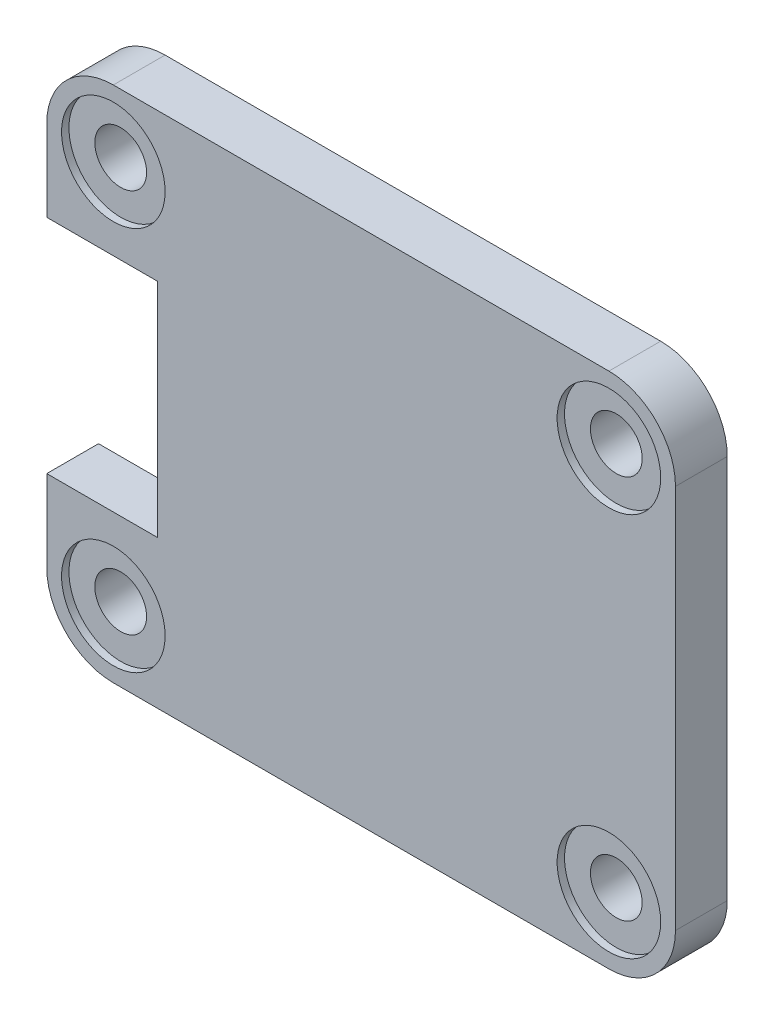
ISO-10303-21;
HEADER;
FILE_DESCRIPTION(('STEP AP214'),'2;1');
FILE_NAME('part.step','',(''),(''),'','','');
FILE_SCHEMA(('AUTOMOTIVE_DESIGN { 1 0 10303 214 1 1 1 1 }'));
ENDSEC;
DATA;
#1=APPLICATION_CONTEXT('core data for automotive mechanical design processes');
#2=APPLICATION_PROTOCOL_DEFINITION('international standard','automotive_design',2000,#1);
#3=PRODUCT_CONTEXT('',#1,'mechanical');
#4=PRODUCT('Part','Part','',(#3));
#5=PRODUCT_RELATED_PRODUCT_CATEGORY('part','',(#4));
#6=PRODUCT_DEFINITION_FORMATION('','',#4);
#7=PRODUCT_DEFINITION_CONTEXT('part definition',#1,'design');
#8=PRODUCT_DEFINITION('design','',#6,#7);
#9=PRODUCT_DEFINITION_SHAPE('','',#8);
#10=(LENGTH_UNIT() NAMED_UNIT(*) SI_UNIT(.MILLI.,.METRE.));
#11=(NAMED_UNIT(*) PLANE_ANGLE_UNIT() SI_UNIT($,.RADIAN.));
#12=(NAMED_UNIT(*) SI_UNIT($,.STERADIAN.) SOLID_ANGLE_UNIT());
#13=UNCERTAINTY_MEASURE_WITH_UNIT(LENGTH_MEASURE(1.E-05),#10,'distance_accuracy_value','');
#14=(GEOMETRIC_REPRESENTATION_CONTEXT(3) GLOBAL_UNCERTAINTY_ASSIGNED_CONTEXT((#13)) GLOBAL_UNIT_ASSIGNED_CONTEXT((#10,
#11,#12)) REPRESENTATION_CONTEXT('',''));
#15=CARTESIAN_POINT('',(0.,0.,0.));
#16=DIRECTION('',(0.,0.,1.));
#17=DIRECTION('',(1.,0.,0.));
#18=AXIS2_PLACEMENT_3D('',#15,#16,#17);
#19=CARTESIAN_POINT('',(-85.,51.9999999999999,-14.));
#20=DIRECTION('',(-1.,0.,0.));
#21=DIRECTION('',(0.,0.,1.));
#22=AXIS2_PLACEMENT_3D('',#19,#20,#21);
#23=PLANE('',#22);
#24=DIRECTION('',(0.,0.,1.));
#25=VECTOR('',#24,1.);
#26=CARTESIAN_POINT('',(-85.,30.,-14.));
#27=LINE('',#26,#25);
#28=CARTESIAN_POINT('',(-85.,30.,-14.));
#29=VERTEX_POINT('',#28);
#30=CARTESIAN_POINT('',(-85.,30.,0.));
#31=VERTEX_POINT('',#30);
#32=EDGE_CURVE('E235',#29,#31,#27,.T.);
#33=ORIENTED_EDGE('',*,*,#32,.T.);
#34=DIRECTION('',(0.,-1.,0.));
#35=VECTOR('',#34,1.);
#36=CARTESIAN_POINT('',(-85.,51.9999999999999,0.));
#37=LINE('',#36,#35);
#38=CARTESIAN_POINT('',(-85.,51.9999999999999,0.));
#39=VERTEX_POINT('',#38);
#40=EDGE_CURVE('E221',#39,#31,#37,.T.);
#41=ORIENTED_EDGE('',*,*,#40,.F.);
#42=DIRECTION('',(0.,0.,1.));
#43=VECTOR('',#42,1.);
#44=CARTESIAN_POINT('',(-85.,51.9999999999999,-14.));
#45=LINE('',#44,#43);
#46=CARTESIAN_POINT('',(-85.,51.9999999999999,-14.));
#47=VERTEX_POINT('',#46);
#48=EDGE_CURVE('E150',#47,#39,#45,.T.);
#49=ORIENTED_EDGE('',*,*,#48,.F.);
#50=DIRECTION('',(0.,-1.,0.));
#51=VECTOR('',#50,1.);
#52=CARTESIAN_POINT('',(-85.,51.9999999999999,-14.));
#53=LINE('',#52,#51);
#54=EDGE_CURVE('E133',#47,#29,#53,.T.);
#55=ORIENTED_EDGE('',*,*,#54,.T.);
#56=EDGE_LOOP('',(#33,#41,#49,#55));
#57=FACE_BOUND('',#56,.T.);
#58=ADVANCED_FACE('F40',(#57),#23,.T.);
#59=CARTESIAN_POINT('',(67.,52.,-14.));
#60=DIRECTION('',(0.,0.,1.));
#61=DIRECTION('',(1.,0.,0.));
#62=AXIS2_PLACEMENT_3D('',#59,#60,#61);
#63=CYLINDRICAL_SURFACE('',#62,7.);
#64=CARTESIAN_POINT('',(67.,52.,-14.));
#65=DIRECTION('',(0.,0.,1.));
#66=DIRECTION('',(1.,0.,0.));
#67=AXIS2_PLACEMENT_3D('',#64,#65,#66);
#68=CIRCLE('',#67,7.);
#69=CARTESIAN_POINT('',(74.,52.,-14.));
#70=VERTEX_POINT('',#69);
#71=EDGE_CURVE('E189',#70,#70,#68,.T.);
#72=ORIENTED_EDGE('',*,*,#71,.F.);
#73=EDGE_LOOP('',(#72));
#74=FACE_BOUND('',#73,.T.);
#75=CARTESIAN_POINT('',(67.,52.,-2.));
#76=DIRECTION('',(0.,0.,1.));
#77=DIRECTION('',(1.,0.,0.));
#78=AXIS2_PLACEMENT_3D('',#75,#76,#77);
#79=CIRCLE('',#78,7.);
#80=CARTESIAN_POINT('',(74.,52.,-2.));
#81=VERTEX_POINT('',#80);
#82=EDGE_CURVE('E44',#81,#81,#79,.F.);
#83=ORIENTED_EDGE('',*,*,#82,.F.);
#84=EDGE_LOOP('',(#83));
#85=FACE_BOUND('',#84,.T.);
#86=ADVANCED_FACE('F294',(#74,#85),#63,.F.);
#87=CARTESIAN_POINT('',(-67.0000000000001,-51.9999999999999,-14.));
#88=DIRECTION('',(0.,0.,1.));
#89=DIRECTION('',(1.,0.,0.));
#90=AXIS2_PLACEMENT_3D('',#87,#88,#89);
#91=CYLINDRICAL_SURFACE('',#90,7.);
#92=CARTESIAN_POINT('',(-67.0000000000001,-51.9999999999999,-14.));
#93=DIRECTION('',(0.,0.,1.));
#94=DIRECTION('',(1.,0.,0.));
#95=AXIS2_PLACEMENT_3D('',#92,#93,#94);
#96=CIRCLE('',#95,7.);
#97=CARTESIAN_POINT('',(-60.0000000000001,-51.9999999999999,-14.));
#98=VERTEX_POINT('',#97);
#99=EDGE_CURVE('E173',#98,#98,#96,.T.);
#100=ORIENTED_EDGE('',*,*,#99,.F.);
#101=EDGE_LOOP('',(#100));
#102=FACE_BOUND('',#101,.T.);
#103=CARTESIAN_POINT('',(-67.0000000000001,-51.9999999999999,-2.));
#104=DIRECTION('',(0.,0.,1.));
#105=DIRECTION('',(1.,0.,0.));
#106=AXIS2_PLACEMENT_3D('',#103,#104,#105);
#107=CIRCLE('',#106,7.);
#108=CARTESIAN_POINT('',(-60.0000000000001,-51.9999999999999,-2.));
#109=VERTEX_POINT('',#108);
#110=EDGE_CURVE('E168',#109,#109,#107,.F.);
#111=ORIENTED_EDGE('',*,*,#110,.F.);
#112=EDGE_LOOP('',(#111));
#113=FACE_BOUND('',#112,.T.);
#114=ADVANCED_FACE('F300',(#102,#113),#91,.F.);
#115=CARTESIAN_POINT('',(-67.,52.,-14.));
#116=DIRECTION('',(0.,0.,1.));
#117=DIRECTION('',(1.,0.,0.));
#118=AXIS2_PLACEMENT_3D('',#115,#116,#117);
#119=CYLINDRICAL_SURFACE('',#118,7.);
#120=CARTESIAN_POINT('',(-67.,52.,-14.));
#121=DIRECTION('',(0.,0.,-1.));
#122=DIRECTION('',(-1.,0.,0.));
#123=AXIS2_PLACEMENT_3D('',#120,#121,#122);
#124=CIRCLE('',#123,7.);
#125=CARTESIAN_POINT('',(-74.,52.,-14.));
#126=VERTEX_POINT('',#125);
#127=EDGE_CURVE('E177',#126,#126,#124,.T.);
#128=ORIENTED_EDGE('',*,*,#127,.T.);
#129=EDGE_LOOP('',(#128));
#130=FACE_BOUND('',#129,.T.);
#131=CARTESIAN_POINT('',(-67.,52.,-2.));
#132=DIRECTION('',(0.,0.,1.));
#133=DIRECTION('',(1.,0.,0.));
#134=AXIS2_PLACEMENT_3D('',#131,#132,#133);
#135=CIRCLE('',#134,7.);
#136=CARTESIAN_POINT('',(-60.,52.,-2.));
#137=VERTEX_POINT('',#136);
#138=EDGE_CURVE('E165',#137,#137,#135,.T.);
#139=ORIENTED_EDGE('',*,*,#138,.T.);
#140=EDGE_LOOP('',(#139));
#141=FACE_BOUND('',#140,.T.);
#142=ADVANCED_FACE('F398',(#130,#141),#119,.F.);
#143=CARTESIAN_POINT('',(66.9999999999999,-52.0000000000001,-14.));
#144=DIRECTION('',(0.,0.,1.));
#145=DIRECTION('',(1.,0.,0.));
#146=AXIS2_PLACEMENT_3D('',#143,#144,#145);
#147=CYLINDRICAL_SURFACE('',#146,7.);
#148=CARTESIAN_POINT('',(66.9999999999999,-52.0000000000001,-14.));
#149=DIRECTION('',(0.,0.,-1.));
#150=DIRECTION('',(-1.,0.,0.));
#151=AXIS2_PLACEMENT_3D('',#148,#149,#150);
#152=CIRCLE('',#151,7.);
#153=CARTESIAN_POINT('',(59.9999999999999,-52.0000000000001,-14.));
#154=VERTEX_POINT('',#153);
#155=EDGE_CURVE('E182',#154,#154,#152,.T.);
#156=ORIENTED_EDGE('',*,*,#155,.T.);
#157=EDGE_LOOP('',(#156));
#158=FACE_BOUND('',#157,.T.);
#159=CARTESIAN_POINT('',(66.9999999999999,-52.0000000000001,-2.));
#160=DIRECTION('',(0.,0.,1.));
#161=DIRECTION('',(1.,0.,0.));
#162=AXIS2_PLACEMENT_3D('',#159,#160,#161);
#163=CIRCLE('',#162,7.);
#164=CARTESIAN_POINT('',(73.9999999999999,-52.0000000000001,-2.));
#165=VERTEX_POINT('',#164);
#166=EDGE_CURVE('E162',#165,#165,#163,.T.);
#167=ORIENTED_EDGE('',*,*,#166,.T.);
#168=EDGE_LOOP('',(#167));
#169=FACE_BOUND('',#168,.T.);
#170=ADVANCED_FACE('F288',(#158,#169),#147,.F.);
#171=CARTESIAN_POINT('',(67.,52.,-14.));
#172=DIRECTION('',(0.,0.,-1.));
#173=DIRECTION('',(-1.,0.,0.));
#174=AXIS2_PLACEMENT_3D('',#171,#172,#173);
#175=PLANE('',#174);
#176=DIRECTION('',(-1.,0.,0.));
#177=VECTOR('',#176,1.);
#178=CARTESIAN_POINT('',(-55.,30.,-14.));
#179=LINE('',#178,#177);
#180=CARTESIAN_POINT('',(-55.,30.,-14.));
#181=VERTEX_POINT('',#180);
#182=EDGE_CURVE('E257',#181,#29,#179,.T.);
#183=ORIENTED_EDGE('',*,*,#182,.T.);
#184=ORIENTED_EDGE('',*,*,#54,.F.);
#185=CARTESIAN_POINT('',(-67.,52.,-14.));
#186=DIRECTION('',(0.,0.,1.));
#187=DIRECTION('',(1.,0.,0.));
#188=AXIS2_PLACEMENT_3D('',#185,#186,#187);
#189=CIRCLE('',#188,18.);
#190=CARTESIAN_POINT('',(-66.9999999999999,70.,-14.));
#191=VERTEX_POINT('',#190);
#192=EDGE_CURVE('E205',#191,#47,#189,.T.);
#193=ORIENTED_EDGE('',*,*,#192,.F.);
#194=DIRECTION('',(1.,0.,0.));
#195=VECTOR('',#194,1.);
#196=CARTESIAN_POINT('',(-66.9999999999999,70.,-14.));
#197=LINE('',#196,#195);
#198=CARTESIAN_POINT('',(66.9999999999999,70.,-14.));
#199=VERTEX_POINT('',#198);
#200=EDGE_CURVE('E194',#191,#199,#197,.T.);
#201=ORIENTED_EDGE('',*,*,#200,.T.);
#202=CARTESIAN_POINT('',(67.,52.,-14.));
#203=DIRECTION('',(0.,0.,-1.));
#204=DIRECTION('',(-1.,0.,0.));
#205=AXIS2_PLACEMENT_3D('',#202,#203,#204);
#206=CIRCLE('',#205,18.);
#207=CARTESIAN_POINT('',(85.,51.9999999999999,-14.));
#208=VERTEX_POINT('',#207);
#209=EDGE_CURVE('E105',#199,#208,#206,.T.);
#210=ORIENTED_EDGE('',*,*,#209,.T.);
#211=DIRECTION('',(0.,-1.,0.));
#212=VECTOR('',#211,1.);
#213=CARTESIAN_POINT('',(85.,51.9999999999999,-14.));
#214=LINE('',#213,#212);
#215=CARTESIAN_POINT('',(85.,-52.,-14.));
#216=VERTEX_POINT('',#215);
#217=EDGE_CURVE('E198',#208,#216,#214,.T.);
#218=ORIENTED_EDGE('',*,*,#217,.T.);
#219=CARTESIAN_POINT('',(67.,-52.,-14.));
#220=DIRECTION('',(0.,0.,1.));
#221=DIRECTION('',(1.,0.,0.));
#222=AXIS2_PLACEMENT_3D('',#219,#220,#221);
#223=CIRCLE('',#222,18.);
#224=CARTESIAN_POINT('',(66.9999999999999,-70.,-14.));
#225=VERTEX_POINT('',#224);
#226=EDGE_CURVE('E200',#225,#216,#223,.T.);
#227=ORIENTED_EDGE('',*,*,#226,.F.);
#228=DIRECTION('',(1.,0.,0.));
#229=VECTOR('',#228,1.);
#230=CARTESIAN_POINT('',(-66.9999999999999,-70.,-14.));
#231=LINE('',#230,#229);
#232=CARTESIAN_POINT('',(-66.9999999999999,-70.,-14.));
#233=VERTEX_POINT('',#232);
#234=EDGE_CURVE('E143',#233,#225,#231,.T.);
#235=ORIENTED_EDGE('',*,*,#234,.F.);
#236=CARTESIAN_POINT('',(-67.,-52.,-14.));
#237=DIRECTION('',(0.,0.,-1.));
#238=DIRECTION('',(-1.,0.,0.));
#239=AXIS2_PLACEMENT_3D('',#236,#237,#238);
#240=CIRCLE('',#239,18.);
#241=CARTESIAN_POINT('',(-85.,-51.9999999999999,-14.));
#242=VERTEX_POINT('',#241);
#243=EDGE_CURVE('E134',#233,#242,#240,.T.);
#244=ORIENTED_EDGE('',*,*,#243,.T.);
#245=CARTESIAN_POINT('',(-85.,-30.,-14.));
#246=VERTEX_POINT('',#245);
#247=EDGE_CURVE('E124',#246,#242,#53,.T.);
#248=ORIENTED_EDGE('',*,*,#247,.F.);
#249=DIRECTION('',(1.,0.,0.));
#250=VECTOR('',#249,1.);
#251=CARTESIAN_POINT('',(-55.,-30.,-14.));
#252=LINE('',#251,#250);
#253=CARTESIAN_POINT('',(-55.,-30.,-14.));
#254=VERTEX_POINT('',#253);
#255=EDGE_CURVE('E57',#246,#254,#252,.T.);
#256=ORIENTED_EDGE('',*,*,#255,.T.);
#257=DIRECTION('',(0.,1.,0.));
#258=VECTOR('',#257,1.);
#259=CARTESIAN_POINT('',(-55.,30.,-14.));
#260=LINE('',#259,#258);
#261=EDGE_CURVE('E352',#254,#181,#260,.T.);
#262=ORIENTED_EDGE('',*,*,#261,.T.);
#263=EDGE_LOOP('',(#183,#184,#193,#201,#210,#218,#227,#235,#244,#248,#256,#262));
#264=FACE_BOUND('',#263,.T.);
#265=ORIENTED_EDGE('',*,*,#127,.F.);
#266=EDGE_LOOP('',(#265));
#267=FACE_BOUND('',#266,.T.);
#268=ORIENTED_EDGE('',*,*,#99,.T.);
#269=EDGE_LOOP('',(#268));
#270=FACE_BOUND('',#269,.T.);
#271=ORIENTED_EDGE('',*,*,#71,.T.);
#272=EDGE_LOOP('',(#271));
#273=FACE_BOUND('',#272,.T.);
#274=ORIENTED_EDGE('',*,*,#155,.F.);
#275=EDGE_LOOP('',(#274));
#276=FACE_BOUND('',#275,.T.);
#277=ADVANCED_FACE('F139',(#264,#267,#270,#273,#276),#175,.T.);
#278=CARTESIAN_POINT('',(67.,52.,0.));
#279=DIRECTION('',(0.,0.,-1.));
#280=DIRECTION('',(-1.,0.,0.));
#281=AXIS2_PLACEMENT_3D('',#278,#279,#280);
#282=PLANE('',#281);
#283=CARTESIAN_POINT('',(-67.,52.,0.));
#284=DIRECTION('',(0.,0.,1.));
#285=DIRECTION('',(1.,0.,0.));
#286=AXIS2_PLACEMENT_3D('',#283,#284,#285);
#287=CIRCLE('',#286,14.);
#288=CARTESIAN_POINT('',(-53.,52.,0.));
#289=VERTEX_POINT('',#288);
#290=EDGE_CURVE('E245',#289,#289,#287,.T.);
#291=ORIENTED_EDGE('',*,*,#290,.F.);
#292=EDGE_LOOP('',(#291));
#293=FACE_BOUND('',#292,.T.);
#294=CARTESIAN_POINT('',(67.,52.,0.));
#295=DIRECTION('',(0.,0.,1.));
#296=DIRECTION('',(1.,0.,0.));
#297=AXIS2_PLACEMENT_3D('',#294,#295,#296);
#298=CIRCLE('',#297,14.);
#299=CARTESIAN_POINT('',(81.,52.,0.));
#300=VERTEX_POINT('',#299);
#301=EDGE_CURVE('E264',#300,#300,#298,.T.);
#302=ORIENTED_EDGE('',*,*,#301,.F.);
#303=EDGE_LOOP('',(#302));
#304=FACE_BOUND('',#303,.T.);
#305=CARTESIAN_POINT('',(66.9999999999999,-52.0000000000001,0.));
#306=DIRECTION('',(0.,0.,1.));
#307=DIRECTION('',(1.,0.,0.));
#308=AXIS2_PLACEMENT_3D('',#305,#306,#307);
#309=CIRCLE('',#308,14.);
#310=CARTESIAN_POINT('',(80.9999999999999,-52.0000000000001,0.));
#311=VERTEX_POINT('',#310);
#312=EDGE_CURVE('E258',#311,#311,#309,.T.);
#313=ORIENTED_EDGE('',*,*,#312,.F.);
#314=EDGE_LOOP('',(#313));
#315=FACE_BOUND('',#314,.T.);
#316=CARTESIAN_POINT('',(-67.0000000000001,-51.9999999999999,0.));
#317=DIRECTION('',(0.,0.,1.));
#318=DIRECTION('',(1.,0.,0.));
#319=AXIS2_PLACEMENT_3D('',#316,#317,#318);
#320=CIRCLE('',#319,14.);
#321=CARTESIAN_POINT('',(-53.0000000000001,-51.9999999999999,0.));
#322=VERTEX_POINT('',#321);
#323=EDGE_CURVE('E186',#322,#322,#320,.T.);
#324=ORIENTED_EDGE('',*,*,#323,.F.);
#325=EDGE_LOOP('',(#324));
#326=FACE_BOUND('',#325,.T.);
#327=ORIENTED_EDGE('',*,*,#40,.T.);
#328=DIRECTION('',(-1.,0.,0.));
#329=VECTOR('',#328,1.);
#330=CARTESIAN_POINT('',(-55.,30.,0.));
#331=LINE('',#330,#329);
#332=CARTESIAN_POINT('',(-55.,30.,0.));
#333=VERTEX_POINT('',#332);
#334=EDGE_CURVE('E251',#333,#31,#331,.T.);
#335=ORIENTED_EDGE('',*,*,#334,.F.);
#336=DIRECTION('',(0.,1.,0.));
#337=VECTOR('',#336,1.);
#338=CARTESIAN_POINT('',(-55.,30.,0.));
#339=LINE('',#338,#337);
#340=CARTESIAN_POINT('',(-55.,-30.,0.));
#341=VERTEX_POINT('',#340);
#342=EDGE_CURVE('E350',#341,#333,#339,.T.);
#343=ORIENTED_EDGE('',*,*,#342,.F.);
#344=DIRECTION('',(1.,0.,0.));
#345=VECTOR('',#344,1.);
#346=CARTESIAN_POINT('',(-55.,-30.,0.));
#347=LINE('',#346,#345);
#348=CARTESIAN_POINT('',(-85.,-30.,0.));
#349=VERTEX_POINT('',#348);
#350=EDGE_CURVE('E337',#349,#341,#347,.T.);
#351=ORIENTED_EDGE('',*,*,#350,.F.);
#352=CARTESIAN_POINT('',(-85.,-51.9999999999999,0.));
#353=VERTEX_POINT('',#352);
#354=EDGE_CURVE('E220',#349,#353,#37,.T.);
#355=ORIENTED_EDGE('',*,*,#354,.T.);
#356=CARTESIAN_POINT('',(-67.,-52.,0.));
#357=DIRECTION('',(0.,0.,-1.));
#358=DIRECTION('',(-1.,0.,0.));
#359=AXIS2_PLACEMENT_3D('',#356,#357,#358);
#360=CIRCLE('',#359,18.);
#361=CARTESIAN_POINT('',(-66.9999999999999,-70.,0.));
#362=VERTEX_POINT('',#361);
#363=EDGE_CURVE('E148',#362,#353,#360,.T.);
#364=ORIENTED_EDGE('',*,*,#363,.F.);
#365=DIRECTION('',(1.,0.,0.));
#366=VECTOR('',#365,1.);
#367=CARTESIAN_POINT('',(-66.9999999999999,-70.,0.));
#368=LINE('',#367,#366);
#369=CARTESIAN_POINT('',(66.9999999999999,-70.,0.));
#370=VERTEX_POINT('',#369);
#371=EDGE_CURVE('E216',#362,#370,#368,.T.);
#372=ORIENTED_EDGE('',*,*,#371,.T.);
#373=CARTESIAN_POINT('',(67.,-52.,0.));
#374=DIRECTION('',(0.,0.,1.));
#375=DIRECTION('',(1.,0.,0.));
#376=AXIS2_PLACEMENT_3D('',#373,#374,#375);
#377=CIRCLE('',#376,18.);
#378=CARTESIAN_POINT('',(85.,-52.,0.));
#379=VERTEX_POINT('',#378);
#380=EDGE_CURVE('E213',#370,#379,#377,.T.);
#381=ORIENTED_EDGE('',*,*,#380,.T.);
#382=DIRECTION('',(0.,-1.,0.));
#383=VECTOR('',#382,1.);
#384=CARTESIAN_POINT('',(85.,51.9999999999999,0.));
#385=LINE('',#384,#383);
#386=CARTESIAN_POINT('',(85.,51.9999999999999,0.));
#387=VERTEX_POINT('',#386);
#388=EDGE_CURVE('E210',#387,#379,#385,.T.);
#389=ORIENTED_EDGE('',*,*,#388,.F.);
#390=CARTESIAN_POINT('',(67.,52.,0.));
#391=DIRECTION('',(0.,0.,-1.));
#392=DIRECTION('',(-1.,0.,0.));
#393=AXIS2_PLACEMENT_3D('',#390,#391,#392);
#394=CIRCLE('',#393,18.);
#395=CARTESIAN_POINT('',(66.9999999999999,70.,0.));
#396=VERTEX_POINT('',#395);
#397=EDGE_CURVE('E208',#396,#387,#394,.T.);
#398=ORIENTED_EDGE('',*,*,#397,.F.);
#399=DIRECTION('',(1.,0.,0.));
#400=VECTOR('',#399,1.);
#401=CARTESIAN_POINT('',(-66.9999999999999,70.,0.));
#402=LINE('',#401,#400);
#403=CARTESIAN_POINT('',(-66.9999999999999,70.,0.));
#404=VERTEX_POINT('',#403);
#405=EDGE_CURVE('E193',#404,#396,#402,.T.);
#406=ORIENTED_EDGE('',*,*,#405,.F.);
#407=CARTESIAN_POINT('',(-67.,52.,0.));
#408=DIRECTION('',(0.,0.,1.));
#409=DIRECTION('',(1.,0.,0.));
#410=AXIS2_PLACEMENT_3D('',#407,#408,#409);
#411=CIRCLE('',#410,18.);
#412=EDGE_CURVE('E196',#404,#39,#411,.T.);
#413=ORIENTED_EDGE('',*,*,#412,.T.);
#414=EDGE_LOOP('',(#327,#335,#343,#351,#355,#364,#372,#381,#389,#398,#406,#413));
#415=FACE_BOUND('',#414,.T.);
#416=ADVANCED_FACE('F226',(#293,#304,#315,#326,#415),#282,.F.);
#417=CARTESIAN_POINT('',(-66.9999999999999,70.,-14.));
#418=DIRECTION('',(0.,-1.,0.));
#419=DIRECTION('',(0.,0.,-1.));
#420=AXIS2_PLACEMENT_3D('',#417,#418,#419);
#421=PLANE('',#420);
#422=ORIENTED_EDGE('',*,*,#405,.T.);
#423=DIRECTION('',(0.,0.,1.));
#424=VECTOR('',#423,1.);
#425=CARTESIAN_POINT('',(66.9999999999999,70.,-14.));
#426=LINE('',#425,#424);
#427=EDGE_CURVE('E11',#199,#396,#426,.T.);
#428=ORIENTED_EDGE('',*,*,#427,.F.);
#429=ORIENTED_EDGE('',*,*,#200,.F.);
#430=DIRECTION('',(0.,0.,1.));
#431=VECTOR('',#430,1.);
#432=CARTESIAN_POINT('',(-66.9999999999999,70.,-14.));
#433=LINE('',#432,#431);
#434=EDGE_CURVE('E66',#191,#404,#433,.T.);
#435=ORIENTED_EDGE('',*,*,#434,.T.);
#436=EDGE_LOOP('',(#422,#428,#429,#435));
#437=FACE_BOUND('',#436,.T.);
#438=ADVANCED_FACE('F42',(#437),#421,.F.);
#439=CARTESIAN_POINT('',(67.,52.,-14.));
#440=DIRECTION('',(0.,0.,1.));
#441=DIRECTION('',(1.,0.,0.));
#442=AXIS2_PLACEMENT_3D('',#439,#440,#441);
#443=CYLINDRICAL_SURFACE('',#442,18.);
#444=ORIENTED_EDGE('',*,*,#397,.T.);
#445=DIRECTION('',(0.,0.,1.));
#446=VECTOR('',#445,1.);
#447=CARTESIAN_POINT('',(85.,51.9999999999999,-14.));
#448=LINE('',#447,#446);
#449=EDGE_CURVE('E49',#208,#387,#448,.T.);
#450=ORIENTED_EDGE('',*,*,#449,.F.);
#451=ORIENTED_EDGE('',*,*,#209,.F.);
#452=ORIENTED_EDGE('',*,*,#427,.T.);
#453=EDGE_LOOP('',(#444,#450,#451,#452));
#454=FACE_BOUND('',#453,.T.);
#455=ADVANCED_FACE('F287',(#454),#443,.T.);
#456=CARTESIAN_POINT('',(85.,51.9999999999999,-14.));
#457=DIRECTION('',(-1.,0.,0.));
#458=DIRECTION('',(0.,0.,1.));
#459=AXIS2_PLACEMENT_3D('',#456,#457,#458);
#460=PLANE('',#459);
#461=ORIENTED_EDGE('',*,*,#388,.T.);
#462=DIRECTION('',(0.,0.,1.));
#463=VECTOR('',#462,1.);
#464=CARTESIAN_POINT('',(85.,-52.,-14.));
#465=LINE('',#464,#463);
#466=EDGE_CURVE('E158',#216,#379,#465,.T.);
#467=ORIENTED_EDGE('',*,*,#466,.F.);
#468=ORIENTED_EDGE('',*,*,#217,.F.);
#469=ORIENTED_EDGE('',*,*,#449,.T.);
#470=EDGE_LOOP('',(#461,#467,#468,#469));
#471=FACE_BOUND('',#470,.T.);
#472=ADVANCED_FACE('F320',(#471),#460,.F.);
#473=CARTESIAN_POINT('',(67.,-52.,-14.));
#474=DIRECTION('',(0.,0.,1.));
#475=DIRECTION('',(1.,0.,0.));
#476=AXIS2_PLACEMENT_3D('',#473,#474,#475);
#477=CYLINDRICAL_SURFACE('',#476,18.);
#478=ORIENTED_EDGE('',*,*,#380,.F.);
#479=DIRECTION('',(0.,0.,1.));
#480=VECTOR('',#479,1.);
#481=CARTESIAN_POINT('',(66.9999999999999,-70.,-14.));
#482=LINE('',#481,#480);
#483=EDGE_CURVE('E152',#225,#370,#482,.T.);
#484=ORIENTED_EDGE('',*,*,#483,.F.);
#485=ORIENTED_EDGE('',*,*,#226,.T.);
#486=ORIENTED_EDGE('',*,*,#466,.T.);
#487=EDGE_LOOP('',(#478,#484,#485,#486));
#488=FACE_BOUND('',#487,.T.);
#489=ADVANCED_FACE('F314',(#488),#477,.T.);
#490=CARTESIAN_POINT('',(-66.9999999999999,-70.,-14.));
#491=DIRECTION('',(0.,-1.,0.));
#492=DIRECTION('',(0.,0.,-1.));
#493=AXIS2_PLACEMENT_3D('',#490,#491,#492);
#494=PLANE('',#493);
#495=ORIENTED_EDGE('',*,*,#371,.F.);
#496=DIRECTION('',(0.,0.,1.));
#497=VECTOR('',#496,1.);
#498=CARTESIAN_POINT('',(-66.9999999999999,-70.,-14.));
#499=LINE('',#498,#497);
#500=EDGE_CURVE('E149',#233,#362,#499,.T.);
#501=ORIENTED_EDGE('',*,*,#500,.F.);
#502=ORIENTED_EDGE('',*,*,#234,.T.);
#503=ORIENTED_EDGE('',*,*,#483,.T.);
#504=EDGE_LOOP('',(#495,#501,#502,#503));
#505=FACE_BOUND('',#504,.T.);
#506=ADVANCED_FACE('F310',(#505),#494,.T.);
#507=CARTESIAN_POINT('',(-67.,-52.,-14.));
#508=DIRECTION('',(0.,0.,1.));
#509=DIRECTION('',(1.,0.,0.));
#510=AXIS2_PLACEMENT_3D('',#507,#508,#509);
#511=CYLINDRICAL_SURFACE('',#510,18.);
#512=ORIENTED_EDGE('',*,*,#363,.T.);
#513=DIRECTION('',(0.,0.,1.));
#514=VECTOR('',#513,1.);
#515=CARTESIAN_POINT('',(-85.,-51.9999999999999,-14.));
#516=LINE('',#515,#514);
#517=EDGE_CURVE('E129',#242,#353,#516,.T.);
#518=ORIENTED_EDGE('',*,*,#517,.F.);
#519=ORIENTED_EDGE('',*,*,#243,.F.);
#520=ORIENTED_EDGE('',*,*,#500,.T.);
#521=EDGE_LOOP('',(#512,#518,#519,#520));
#522=FACE_BOUND('',#521,.T.);
#523=ADVANCED_FACE('F146',(#522),#511,.T.);
#524=DIRECTION('',(0.,0.,1.));
#525=VECTOR('',#524,1.);
#526=CARTESIAN_POINT('',(-85.,-30.,-14.));
#527=LINE('',#526,#525);
#528=EDGE_CURVE('E131',#246,#349,#527,.T.);
#529=ORIENTED_EDGE('',*,*,#528,.F.);
#530=ORIENTED_EDGE('',*,*,#247,.T.);
#531=ORIENTED_EDGE('',*,*,#517,.T.);
#532=ORIENTED_EDGE('',*,*,#354,.F.);
#533=EDGE_LOOP('',(#529,#530,#531,#532));
#534=FACE_BOUND('',#533,.T.);
#535=ADVANCED_FACE('F126',(#534),#23,.T.);
#536=CARTESIAN_POINT('',(-67.,52.,-14.));
#537=DIRECTION('',(0.,0.,1.));
#538=DIRECTION('',(1.,0.,0.));
#539=AXIS2_PLACEMENT_3D('',#536,#537,#538);
#540=CYLINDRICAL_SURFACE('',#539,18.);
#541=ORIENTED_EDGE('',*,*,#412,.F.);
#542=ORIENTED_EDGE('',*,*,#434,.F.);
#543=ORIENTED_EDGE('',*,*,#192,.T.);
#544=ORIENTED_EDGE('',*,*,#48,.T.);
#545=EDGE_LOOP('',(#541,#542,#543,#544));
#546=FACE_BOUND('',#545,.T.);
#547=ADVANCED_FACE('F229',(#546),#540,.T.);
#548=CARTESIAN_POINT('',(66.9999999999999,-52.0000000000001,-2.));
#549=DIRECTION('',(0.,0.,1.));
#550=DIRECTION('',(1.,0.,0.));
#551=AXIS2_PLACEMENT_3D('',#548,#549,#550);
#552=CYLINDRICAL_SURFACE('',#551,14.);
#553=CARTESIAN_POINT('',(66.9999999999999,-52.0000000000001,-2.));
#554=DIRECTION('',(0.,0.,1.));
#555=DIRECTION('',(1.,0.,0.));
#556=AXIS2_PLACEMENT_3D('',#553,#554,#555);
#557=CIRCLE('',#556,14.);
#558=CARTESIAN_POINT('',(80.9999999999999,-52.0000000000001,-2.));
#559=VERTEX_POINT('',#558);
#560=EDGE_CURVE('E261',#559,#559,#557,.T.);
#561=ORIENTED_EDGE('',*,*,#560,.F.);
#562=EDGE_LOOP('',(#561));
#563=FACE_BOUND('',#562,.T.);
#564=ORIENTED_EDGE('',*,*,#312,.T.);
#565=EDGE_LOOP('',(#564));
#566=FACE_BOUND('',#565,.T.);
#567=ADVANCED_FACE('F308',(#563,#566),#552,.F.);
#568=CARTESIAN_POINT('',(66.9999999999999,-52.0000000000001,-2.));
#569=DIRECTION('',(0.,0.,1.));
#570=DIRECTION('',(1.,0.,0.));
#571=AXIS2_PLACEMENT_3D('',#568,#569,#570);
#572=PLANE('',#571);
#573=ORIENTED_EDGE('',*,*,#166,.F.);
#574=EDGE_LOOP('',(#573));
#575=FACE_BOUND('',#574,.T.);
#576=ORIENTED_EDGE('',*,*,#560,.T.);
#577=EDGE_LOOP('',(#576));
#578=FACE_BOUND('',#577,.T.);
#579=ADVANCED_FACE('F369',(#575,#578),#572,.T.);
#580=CARTESIAN_POINT('',(-67.,52.,-2.));
#581=DIRECTION('',(0.,0.,1.));
#582=DIRECTION('',(1.,0.,0.));
#583=AXIS2_PLACEMENT_3D('',#580,#581,#582);
#584=CYLINDRICAL_SURFACE('',#583,14.);
#585=CARTESIAN_POINT('',(-67.,52.,-2.));
#586=DIRECTION('',(0.,0.,1.));
#587=DIRECTION('',(1.,0.,0.));
#588=AXIS2_PLACEMENT_3D('',#585,#586,#587);
#589=CIRCLE('',#588,14.);
#590=CARTESIAN_POINT('',(-53.,52.,-2.));
#591=VERTEX_POINT('',#590);
#592=EDGE_CURVE('E241',#591,#591,#589,.T.);
#593=ORIENTED_EDGE('',*,*,#592,.F.);
#594=EDGE_LOOP('',(#593));
#595=FACE_BOUND('',#594,.T.);
#596=ORIENTED_EDGE('',*,*,#290,.T.);
#597=EDGE_LOOP('',(#596));
#598=FACE_BOUND('',#597,.T.);
#599=ADVANCED_FACE('F373',(#595,#598),#584,.F.);
#600=CARTESIAN_POINT('',(-67.,52.,-2.));
#601=DIRECTION('',(0.,0.,1.));
#602=DIRECTION('',(1.,0.,0.));
#603=AXIS2_PLACEMENT_3D('',#600,#601,#602);
#604=PLANE('',#603);
#605=ORIENTED_EDGE('',*,*,#138,.F.);
#606=EDGE_LOOP('',(#605));
#607=FACE_BOUND('',#606,.T.);
#608=ORIENTED_EDGE('',*,*,#592,.T.);
#609=EDGE_LOOP('',(#608));
#610=FACE_BOUND('',#609,.T.);
#611=ADVANCED_FACE('F385',(#607,#610),#604,.T.);
#612=CARTESIAN_POINT('',(-67.0000000000001,-51.9999999999999,-2.));
#613=DIRECTION('',(0.,0.,1.));
#614=DIRECTION('',(1.,0.,0.));
#615=AXIS2_PLACEMENT_3D('',#612,#613,#614);
#616=PLANE('',#615);
#617=CARTESIAN_POINT('',(-67.0000000000001,-51.9999999999999,-2.));
#618=DIRECTION('',(0.,0.,1.));
#619=DIRECTION('',(1.,0.,0.));
#620=AXIS2_PLACEMENT_3D('',#617,#618,#619);
#621=CIRCLE('',#620,14.);
#622=CARTESIAN_POINT('',(-53.0000000000001,-51.9999999999999,-2.));
#623=VERTEX_POINT('',#622);
#624=EDGE_CURVE('E166',#623,#623,#621,.T.);
#625=ORIENTED_EDGE('',*,*,#624,.T.);
#626=EDGE_LOOP('',(#625));
#627=FACE_BOUND('',#626,.T.);
#628=ORIENTED_EDGE('',*,*,#110,.T.);
#629=EDGE_LOOP('',(#628));
#630=FACE_BOUND('',#629,.T.);
#631=ADVANCED_FACE('F389',(#627,#630),#616,.T.);
#632=CARTESIAN_POINT('',(-67.0000000000001,-51.9999999999999,-2.));
#633=DIRECTION('',(0.,0.,1.));
#634=DIRECTION('',(1.,0.,0.));
#635=AXIS2_PLACEMENT_3D('',#632,#633,#634);
#636=CYLINDRICAL_SURFACE('',#635,14.);
#637=ORIENTED_EDGE('',*,*,#624,.F.);
#638=EDGE_LOOP('',(#637));
#639=FACE_BOUND('',#638,.T.);
#640=ORIENTED_EDGE('',*,*,#323,.T.);
#641=EDGE_LOOP('',(#640));
#642=FACE_BOUND('',#641,.T.);
#643=ADVANCED_FACE('F277',(#639,#642),#636,.F.);
#644=CARTESIAN_POINT('',(67.,52.,-2.));
#645=DIRECTION('',(0.,0.,1.));
#646=DIRECTION('',(1.,0.,0.));
#647=AXIS2_PLACEMENT_3D('',#644,#645,#646);
#648=PLANE('',#647);
#649=CARTESIAN_POINT('',(67.,52.,-2.));
#650=DIRECTION('',(0.,0.,1.));
#651=DIRECTION('',(1.,0.,0.));
#652=AXIS2_PLACEMENT_3D('',#649,#650,#651);
#653=CIRCLE('',#652,14.);
#654=CARTESIAN_POINT('',(81.,52.,-2.));
#655=VERTEX_POINT('',#654);
#656=EDGE_CURVE('E267',#655,#655,#653,.T.);
#657=ORIENTED_EDGE('',*,*,#656,.T.);
#658=EDGE_LOOP('',(#657));
#659=FACE_BOUND('',#658,.T.);
#660=ORIENTED_EDGE('',*,*,#82,.T.);
#661=EDGE_LOOP('',(#660));
#662=FACE_BOUND('',#661,.T.);
#663=ADVANCED_FACE('F378',(#659,#662),#648,.T.);
#664=CARTESIAN_POINT('',(67.,52.,-2.));
#665=DIRECTION('',(0.,0.,1.));
#666=DIRECTION('',(1.,0.,0.));
#667=AXIS2_PLACEMENT_3D('',#664,#665,#666);
#668=CYLINDRICAL_SURFACE('',#667,14.);
#669=ORIENTED_EDGE('',*,*,#656,.F.);
#670=EDGE_LOOP('',(#669));
#671=FACE_BOUND('',#670,.T.);
#672=ORIENTED_EDGE('',*,*,#301,.T.);
#673=EDGE_LOOP('',(#672));
#674=FACE_BOUND('',#673,.T.);
#675=ADVANCED_FACE('F375',(#671,#674),#668,.F.);
#676=CARTESIAN_POINT('',(-55.,30.,-14.));
#677=DIRECTION('',(0.,1.,0.));
#678=DIRECTION('',(-1.,0.,0.));
#679=AXIS2_PLACEMENT_3D('',#676,#677,#678);
#680=PLANE('',#679);
#681=ORIENTED_EDGE('',*,*,#334,.T.);
#682=ORIENTED_EDGE('',*,*,#32,.F.);
#683=ORIENTED_EDGE('',*,*,#182,.F.);
#684=DIRECTION('',(0.,0.,1.));
#685=VECTOR('',#684,1.);
#686=CARTESIAN_POINT('',(-55.,30.,-14.));
#687=LINE('',#686,#685);
#688=EDGE_CURVE('E242',#181,#333,#687,.T.);
#689=ORIENTED_EDGE('',*,*,#688,.T.);
#690=EDGE_LOOP('',(#681,#682,#683,#689));
#691=FACE_BOUND('',#690,.T.);
#692=ADVANCED_FACE('F345',(#691),#680,.F.);
#693=CARTESIAN_POINT('',(-55.,30.,-14.));
#694=DIRECTION('',(1.,0.,0.));
#695=DIRECTION('',(0.,1.,0.));
#696=AXIS2_PLACEMENT_3D('',#693,#694,#695);
#697=PLANE('',#696);
#698=ORIENTED_EDGE('',*,*,#342,.T.);
#699=ORIENTED_EDGE('',*,*,#688,.F.);
#700=ORIENTED_EDGE('',*,*,#261,.F.);
#701=DIRECTION('',(0.,0.,1.));
#702=VECTOR('',#701,1.);
#703=CARTESIAN_POINT('',(-55.,-30.,-14.));
#704=LINE('',#703,#702);
#705=EDGE_CURVE('E248',#254,#341,#704,.T.);
#706=ORIENTED_EDGE('',*,*,#705,.T.);
#707=EDGE_LOOP('',(#698,#699,#700,#706));
#708=FACE_BOUND('',#707,.T.);
#709=ADVANCED_FACE('F351',(#708),#697,.F.);
#710=CARTESIAN_POINT('',(-55.,-30.,-14.));
#711=DIRECTION('',(0.,-1.,0.));
#712=DIRECTION('',(1.,0.,0.));
#713=AXIS2_PLACEMENT_3D('',#710,#711,#712);
#714=PLANE('',#713);
#715=ORIENTED_EDGE('',*,*,#350,.T.);
#716=ORIENTED_EDGE('',*,*,#705,.F.);
#717=ORIENTED_EDGE('',*,*,#255,.F.);
#718=ORIENTED_EDGE('',*,*,#528,.T.);
#719=EDGE_LOOP('',(#715,#716,#717,#718));
#720=FACE_BOUND('',#719,.T.);
#721=ADVANCED_FACE('F357',(#720),#714,.F.);
#722=CLOSED_SHELL('',(#58,#86,#114,#142,#170,#277,#416,#438,#455,#472,#489,#506,#523,#535,#547,
#567,#579,#599,#611,#631,#643,#663,#675,#692,#709,#721));
#723=MANIFOLD_SOLID_BREP('B2',#722);
#724=ADVANCED_BREP_SHAPE_REPRESENTATION('',(#18,#723),#14);
#725=SHAPE_DEFINITION_REPRESENTATION(#9,#724);
ENDSEC;
END-ISO-10303-21;
